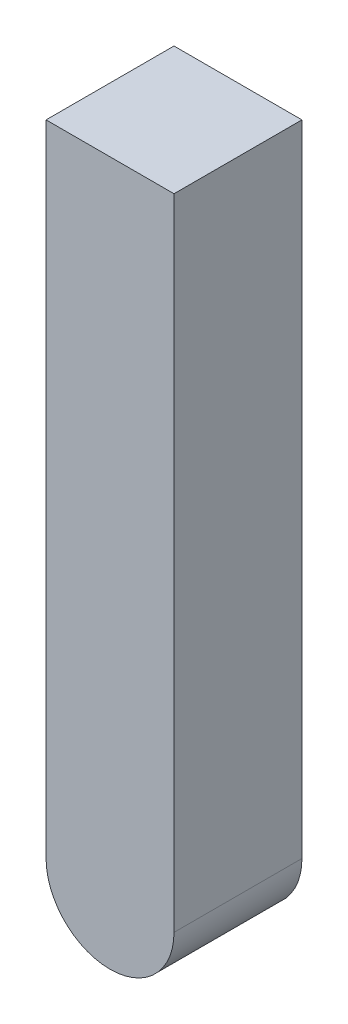
ISO-10303-21;
HEADER;
FILE_DESCRIPTION(('STEP AP214'),'2;1');
FILE_NAME('part.step','',(''),(''),'','','');
FILE_SCHEMA(('AUTOMOTIVE_DESIGN { 1 0 10303 214 1 1 1 1 }'));
ENDSEC;
DATA;
#1=APPLICATION_CONTEXT('core data for automotive mechanical design processes');
#2=APPLICATION_PROTOCOL_DEFINITION('international standard','automotive_design',2000,#1);
#3=PRODUCT_CONTEXT('',#1,'mechanical');
#4=PRODUCT('Part','Part','',(#3));
#5=PRODUCT_RELATED_PRODUCT_CATEGORY('part','',(#4));
#6=PRODUCT_DEFINITION_FORMATION('','',#4);
#7=PRODUCT_DEFINITION_CONTEXT('part definition',#1,'design');
#8=PRODUCT_DEFINITION('design','',#6,#7);
#9=PRODUCT_DEFINITION_SHAPE('','',#8);
#10=(LENGTH_UNIT() NAMED_UNIT(*) SI_UNIT(.MILLI.,.METRE.));
#11=(NAMED_UNIT(*) PLANE_ANGLE_UNIT() SI_UNIT($,.RADIAN.));
#12=(NAMED_UNIT(*) SI_UNIT($,.STERADIAN.) SOLID_ANGLE_UNIT());
#13=UNCERTAINTY_MEASURE_WITH_UNIT(LENGTH_MEASURE(1.E-05),#10,'distance_accuracy_value','');
#14=(GEOMETRIC_REPRESENTATION_CONTEXT(3) GLOBAL_UNCERTAINTY_ASSIGNED_CONTEXT((#13)) GLOBAL_UNIT_ASSIGNED_CONTEXT((#10,
#11,#12)) REPRESENTATION_CONTEXT('',''));
#15=CARTESIAN_POINT('',(0.,0.,0.));
#16=DIRECTION('',(0.,0.,1.));
#17=DIRECTION('',(1.,0.,0.));
#18=AXIS2_PLACEMENT_3D('',#15,#16,#17);
#19=CARTESIAN_POINT('',(0.,0.,20.));
#20=DIRECTION('',(1.,0.,0.));
#21=DIRECTION('',(0.,0.,-1.));
#22=AXIS2_PLACEMENT_3D('',#19,#20,#21);
#23=PLANE('',#22);
#24=DIRECTION('',(0.,-1.,0.));
#25=VECTOR('',#24,1.);
#26=CARTESIAN_POINT('',(0.,0.,0.));
#27=LINE('',#26,#25);
#28=CARTESIAN_POINT('',(0.,110.,0.));
#29=VERTEX_POINT('',#28);
#30=CARTESIAN_POINT('',(0.,10.,0.));
#31=VERTEX_POINT('',#30);
#32=EDGE_CURVE('E101',#29,#31,#27,.T.);
#33=ORIENTED_EDGE('',*,*,#32,.T.);
#34=DIRECTION('',(0.,0.,-1.));
#35=VECTOR('',#34,1.);
#36=CARTESIAN_POINT('',(0.,10.,20.));
#37=LINE('',#36,#35);
#38=CARTESIAN_POINT('',(0.,10.,20.));
#39=VERTEX_POINT('',#38);
#40=EDGE_CURVE('E110',#31,#39,#37,.F.);
#41=ORIENTED_EDGE('',*,*,#40,.T.);
#42=DIRECTION('',(0.,-1.,0.));
#43=VECTOR('',#42,1.);
#44=CARTESIAN_POINT('',(0.,0.,20.));
#45=LINE('',#44,#43);
#46=CARTESIAN_POINT('',(0.,110.,20.));
#47=VERTEX_POINT('',#46);
#48=EDGE_CURVE('E82',#47,#39,#45,.T.);
#49=ORIENTED_EDGE('',*,*,#48,.F.);
#50=DIRECTION('',(0.,0.,-1.));
#51=VECTOR('',#50,1.);
#52=CARTESIAN_POINT('',(0.,110.,20.));
#53=LINE('',#52,#51);
#54=EDGE_CURVE('E92',#47,#29,#53,.T.);
#55=ORIENTED_EDGE('',*,*,#54,.T.);
#56=EDGE_LOOP('',(#33,#41,#49,#55));
#57=FACE_BOUND('',#56,.T.);
#58=ADVANCED_FACE('F33',(#57),#23,.F.);
#59=CARTESIAN_POINT('',(20.,0.,20.));
#60=DIRECTION('',(-1.,0.,0.));
#61=DIRECTION('',(0.,0.,1.));
#62=AXIS2_PLACEMENT_3D('',#59,#60,#61);
#63=PLANE('',#62);
#64=DIRECTION('',(0.,1.,0.));
#65=VECTOR('',#64,1.);
#66=CARTESIAN_POINT('',(20.,0.,20.));
#67=LINE('',#66,#65);
#68=CARTESIAN_POINT('',(20.,10.,20.));
#69=VERTEX_POINT('',#68);
#70=CARTESIAN_POINT('',(20.,110.,20.));
#71=VERTEX_POINT('',#70);
#72=EDGE_CURVE('E74',#69,#71,#67,.T.);
#73=ORIENTED_EDGE('',*,*,#72,.F.);
#74=DIRECTION('',(0.,0.,-1.));
#75=VECTOR('',#74,1.);
#76=CARTESIAN_POINT('',(20.,10.,20.));
#77=LINE('',#76,#75);
#78=CARTESIAN_POINT('',(20.,10.,0.));
#79=VERTEX_POINT('',#78);
#80=EDGE_CURVE('E11',#69,#79,#77,.T.);
#81=ORIENTED_EDGE('',*,*,#80,.T.);
#82=DIRECTION('',(0.,1.,0.));
#83=VECTOR('',#82,1.);
#84=CARTESIAN_POINT('',(20.,0.,0.));
#85=LINE('',#84,#83);
#86=CARTESIAN_POINT('',(20.,110.,0.));
#87=VERTEX_POINT('',#86);
#88=EDGE_CURVE('E88',#79,#87,#85,.T.);
#89=ORIENTED_EDGE('',*,*,#88,.T.);
#90=DIRECTION('',(0.,0.,-1.));
#91=VECTOR('',#90,1.);
#92=CARTESIAN_POINT('',(20.,110.,20.));
#93=LINE('',#92,#91);
#94=EDGE_CURVE('E85',#71,#87,#93,.T.);
#95=ORIENTED_EDGE('',*,*,#94,.F.);
#96=EDGE_LOOP('',(#73,#81,#89,#95));
#97=FACE_BOUND('',#96,.T.);
#98=ADVANCED_FACE('F86',(#97),#63,.F.);
#99=CARTESIAN_POINT('',(0.,110.,20.));
#100=DIRECTION('',(0.,-1.,0.));
#101=DIRECTION('',(0.,0.,-1.));
#102=AXIS2_PLACEMENT_3D('',#99,#100,#101);
#103=PLANE('',#102);
#104=DIRECTION('',(-1.,0.,0.));
#105=VECTOR('',#104,1.);
#106=CARTESIAN_POINT('',(0.,110.,0.));
#107=LINE('',#106,#105);
#108=EDGE_CURVE('E105',#87,#29,#107,.T.);
#109=ORIENTED_EDGE('',*,*,#108,.T.);
#110=ORIENTED_EDGE('',*,*,#54,.F.);
#111=DIRECTION('',(-1.,0.,0.));
#112=VECTOR('',#111,1.);
#113=CARTESIAN_POINT('',(0.,110.,20.));
#114=LINE('',#113,#112);
#115=EDGE_CURVE('E78',#71,#47,#114,.T.);
#116=ORIENTED_EDGE('',*,*,#115,.F.);
#117=ORIENTED_EDGE('',*,*,#94,.T.);
#118=EDGE_LOOP('',(#109,#110,#116,#117));
#119=FACE_BOUND('',#118,.T.);
#120=ADVANCED_FACE('F94',(#119),#103,.F.);
#121=CARTESIAN_POINT('',(0.,0.,20.));
#122=DIRECTION('',(0.,0.,-1.));
#123=DIRECTION('',(-1.,0.,0.));
#124=AXIS2_PLACEMENT_3D('',#121,#122,#123);
#125=PLANE('',#124);
#126=ORIENTED_EDGE('',*,*,#48,.T.);
#127=CARTESIAN_POINT('',(10.,10.,20.));
#128=DIRECTION('',(0.,0.,-1.));
#129=DIRECTION('',(-1.,0.,0.));
#130=AXIS2_PLACEMENT_3D('',#127,#128,#129);
#131=CIRCLE('',#130,10.);
#132=CARTESIAN_POINT('',(10.,0.,20.));
#133=VERTEX_POINT('',#132);
#134=EDGE_CURVE('E42',#39,#133,#131,.F.);
#135=ORIENTED_EDGE('',*,*,#134,.T.);
#136=CARTESIAN_POINT('',(10.,10.,20.));
#137=DIRECTION('',(0.,0.,-1.));
#138=DIRECTION('',(-1.,0.,0.));
#139=AXIS2_PLACEMENT_3D('',#136,#137,#138);
#140=CIRCLE('',#139,10.);
#141=EDGE_CURVE('E49',#133,#69,#140,.F.);
#142=ORIENTED_EDGE('',*,*,#141,.T.);
#143=ORIENTED_EDGE('',*,*,#72,.T.);
#144=ORIENTED_EDGE('',*,*,#115,.T.);
#145=EDGE_LOOP('',(#126,#135,#142,#143,#144));
#146=FACE_BOUND('',#145,.T.);
#147=ADVANCED_FACE('F76',(#146),#125,.F.);
#148=CARTESIAN_POINT('',(0.,0.,0.));
#149=DIRECTION('',(0.,0.,-1.));
#150=DIRECTION('',(-1.,0.,0.));
#151=AXIS2_PLACEMENT_3D('',#148,#149,#150);
#152=PLANE('',#151);
#153=CARTESIAN_POINT('',(10.,10.,0.));
#154=DIRECTION('',(0.,0.,-1.));
#155=DIRECTION('',(-1.,0.,0.));
#156=AXIS2_PLACEMENT_3D('',#153,#154,#155);
#157=CIRCLE('',#156,10.);
#158=CARTESIAN_POINT('',(10.,0.,0.));
#159=VERTEX_POINT('',#158);
#160=EDGE_CURVE('E91',#79,#159,#157,.T.);
#161=ORIENTED_EDGE('',*,*,#160,.T.);
#162=CARTESIAN_POINT('',(10.,10.,0.));
#163=DIRECTION('',(0.,0.,-1.));
#164=DIRECTION('',(-1.,0.,0.));
#165=AXIS2_PLACEMENT_3D('',#162,#163,#164);
#166=CIRCLE('',#165,10.);
#167=EDGE_CURVE('E108',#159,#31,#166,.T.);
#168=ORIENTED_EDGE('',*,*,#167,.T.);
#169=ORIENTED_EDGE('',*,*,#32,.F.);
#170=ORIENTED_EDGE('',*,*,#108,.F.);
#171=ORIENTED_EDGE('',*,*,#88,.F.);
#172=EDGE_LOOP('',(#161,#168,#169,#170,#171));
#173=FACE_BOUND('',#172,.T.);
#174=ADVANCED_FACE('F125',(#173),#152,.T.);
#175=CARTESIAN_POINT('',(10.,10.,20.));
#176=DIRECTION('',(0.,0.,-1.));
#177=DIRECTION('',(-1.,0.,0.));
#178=AXIS2_PLACEMENT_3D('',#175,#176,#177);
#179=CYLINDRICAL_SURFACE('',#178,10.);
#180=ORIENTED_EDGE('',*,*,#80,.F.);
#181=ORIENTED_EDGE('',*,*,#141,.F.);
#182=DIRECTION('',(0.,0.,-1.));
#183=VECTOR('',#182,1.);
#184=CARTESIAN_POINT('',(10.,0.,20.));
#185=LINE('',#184,#183);
#186=EDGE_CURVE('E37',#159,#133,#185,.F.);
#187=ORIENTED_EDGE('',*,*,#186,.F.);
#188=ORIENTED_EDGE('',*,*,#160,.F.);
#189=EDGE_LOOP('',(#180,#181,#187,#188));
#190=FACE_BOUND('',#189,.T.);
#191=ADVANCED_FACE('F35',(#190),#179,.T.);
#192=CARTESIAN_POINT('',(10.,10.,20.));
#193=DIRECTION('',(0.,0.,-1.));
#194=DIRECTION('',(-1.,0.,0.));
#195=AXIS2_PLACEMENT_3D('',#192,#193,#194);
#196=CYLINDRICAL_SURFACE('',#195,10.);
#197=ORIENTED_EDGE('',*,*,#134,.F.);
#198=ORIENTED_EDGE('',*,*,#40,.F.);
#199=ORIENTED_EDGE('',*,*,#167,.F.);
#200=ORIENTED_EDGE('',*,*,#186,.T.);
#201=EDGE_LOOP('',(#197,#198,#199,#200));
#202=FACE_BOUND('',#201,.T.);
#203=ADVANCED_FACE('F119',(#202),#196,.T.);
#204=CLOSED_SHELL('',(#58,#98,#120,#147,#174,#191,#203));
#205=MANIFOLD_SOLID_BREP('B2',#204);
#206=ADVANCED_BREP_SHAPE_REPRESENTATION('',(#18,#205),#14);
#207=SHAPE_DEFINITION_REPRESENTATION(#9,#206);
ENDSEC;
END-ISO-10303-21;
